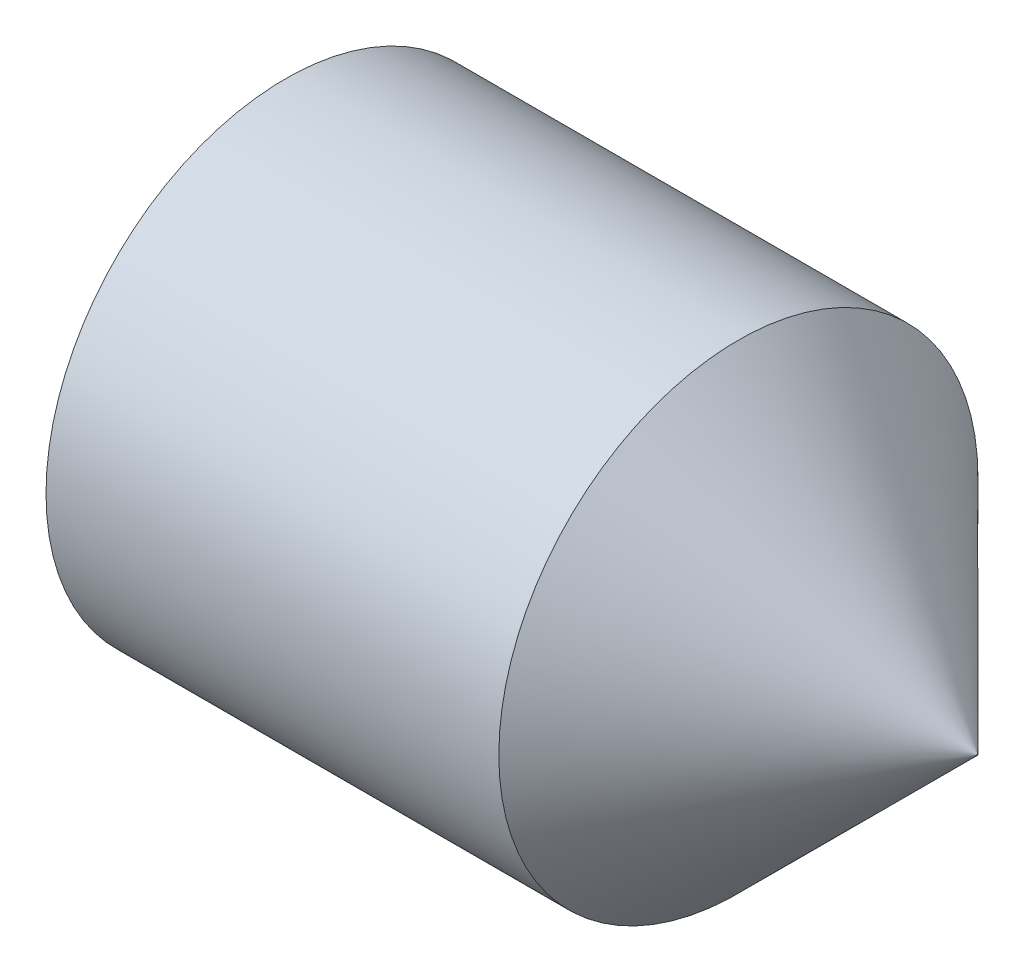
ISO-10303-21;
HEADER;
FILE_DESCRIPTION(('STEP AP214'),'2;1');
FILE_NAME('part.step','',(''),(''),'','','');
FILE_SCHEMA(('AUTOMOTIVE_DESIGN { 1 0 10303 214 1 1 1 1 }'));
ENDSEC;
DATA;
#1=APPLICATION_CONTEXT('core data for automotive mechanical design processes');
#2=APPLICATION_PROTOCOL_DEFINITION('international standard','automotive_design',2000,#1);
#3=PRODUCT_CONTEXT('',#1,'mechanical');
#4=PRODUCT('Part','Part','',(#3));
#5=PRODUCT_RELATED_PRODUCT_CATEGORY('part','',(#4));
#6=PRODUCT_DEFINITION_FORMATION('','',#4);
#7=PRODUCT_DEFINITION_CONTEXT('part definition',#1,'design');
#8=PRODUCT_DEFINITION('design','',#6,#7);
#9=PRODUCT_DEFINITION_SHAPE('','',#8);
#10=(LENGTH_UNIT() NAMED_UNIT(*) SI_UNIT(.MILLI.,.METRE.));
#11=(NAMED_UNIT(*) PLANE_ANGLE_UNIT() SI_UNIT($,.RADIAN.));
#12=(NAMED_UNIT(*) SI_UNIT($,.STERADIAN.) SOLID_ANGLE_UNIT());
#13=UNCERTAINTY_MEASURE_WITH_UNIT(LENGTH_MEASURE(1.E-05),#10,'distance_accuracy_value','');
#14=(GEOMETRIC_REPRESENTATION_CONTEXT(3) GLOBAL_UNCERTAINTY_ASSIGNED_CONTEXT((#13)) GLOBAL_UNIT_ASSIGNED_CONTEXT((#10,
#11,#12)) REPRESENTATION_CONTEXT('',''));
#15=CARTESIAN_POINT('',(0.,0.,0.));
#16=DIRECTION('',(0.,0.,1.));
#17=DIRECTION('',(1.,0.,0.));
#18=AXIS2_PLACEMENT_3D('',#15,#16,#17);
#19=CARTESIAN_POINT('',(0.,0.,0.));
#20=DIRECTION('',(-1.,0.,0.));
#21=DIRECTION('',(0.,0.,1.));
#22=AXIS2_PLACEMENT_3D('',#19,#20,#21);
#23=PLANE('',#22);
#24=CARTESIAN_POINT('',(0.,0.,0.));
#25=DIRECTION('',(-1.,0.,0.));
#26=DIRECTION('',(0.,0.,1.));
#27=AXIS2_PLACEMENT_3D('',#24,#25,#26);
#28=CIRCLE('',#27,1.61);
#29=CARTESIAN_POINT('',(0.,0.,1.61));
#30=VERTEX_POINT('',#29);
#31=EDGE_CURVE('E11',#30,#30,#28,.T.);
#32=ORIENTED_EDGE('',*,*,#31,.T.);
#33=EDGE_LOOP('',(#32));
#34=FACE_BOUND('',#33,.T.);
#35=DIRECTION('',(0.,0.,-1.));
#36=VECTOR('',#35,1.);
#37=CARTESIAN_POINT('',(0.,1.,0.577350269189622));
#38=LINE('',#37,#36);
#39=CARTESIAN_POINT('',(0.,1.,0.577350269189622));
#40=VERTEX_POINT('',#39);
#41=CARTESIAN_POINT('',(0.,1.,-0.577350269189629));
#42=VERTEX_POINT('',#41);
#43=EDGE_CURVE('E127',#40,#42,#38,.T.);
#44=ORIENTED_EDGE('',*,*,#43,.F.);
#45=DIRECTION('',(0.,-0.866025403784438,0.500000000000001));
#46=VECTOR('',#45,1.);
#47=CARTESIAN_POINT('',(0.,1.,0.577350269189622));
#48=LINE('',#47,#46);
#49=CARTESIAN_POINT('',(0.,0.,1.15470053837925));
#50=VERTEX_POINT('',#49);
#51=EDGE_CURVE('E49',#40,#50,#48,.T.);
#52=ORIENTED_EDGE('',*,*,#51,.T.);
#53=DIRECTION('',(0.,0.866025403784438,0.5));
#54=VECTOR('',#53,1.);
#55=CARTESIAN_POINT('',(0.,-0.999999999999996,0.577350269189623));
#56=LINE('',#55,#54);
#57=CARTESIAN_POINT('',(0.,-0.999999999999996,0.577350269189623));
#58=VERTEX_POINT('',#57);
#59=EDGE_CURVE('E118',#58,#50,#56,.T.);
#60=ORIENTED_EDGE('',*,*,#59,.F.);
#61=DIRECTION('',(0.,0.,-1.));
#62=VECTOR('',#61,1.);
#63=CARTESIAN_POINT('',(0.,-0.999999999999996,0.577350269189623));
#64=LINE('',#63,#62);
#65=CARTESIAN_POINT('',(0.,-0.999999999999996,-0.577350269189628));
#66=VERTEX_POINT('',#65);
#67=EDGE_CURVE('E121',#58,#66,#64,.T.);
#68=ORIENTED_EDGE('',*,*,#67,.T.);
#69=DIRECTION('',(0.,0.866025403784438,-0.500000000000001));
#70=VECTOR('',#69,1.);
#71=CARTESIAN_POINT('',(0.,-0.999999999999996,-0.577350269189628));
#72=LINE('',#71,#70);
#73=CARTESIAN_POINT('',(0.,0.,-1.15470053837925));
#74=VERTEX_POINT('',#73);
#75=EDGE_CURVE('E124',#66,#74,#72,.T.);
#76=ORIENTED_EDGE('',*,*,#75,.T.);
#77=DIRECTION('',(0.,-0.866025403784439,-0.5));
#78=VECTOR('',#77,1.);
#79=CARTESIAN_POINT('',(0.,1.,-0.577350269189629));
#80=LINE('',#79,#78);
#81=EDGE_CURVE('E107',#42,#74,#80,.T.);
#82=ORIENTED_EDGE('',*,*,#81,.F.);
#83=EDGE_LOOP('',(#44,#52,#60,#68,#76,#82));
#84=FACE_BOUND('',#83,.T.);
#85=ADVANCED_FACE('F35',(#34,#84),#23,.T.);
#86=CARTESIAN_POINT('',(0.,0.,0.));
#87=DIRECTION('',(1.,0.,0.));
#88=DIRECTION('',(0.,0.,-1.));
#89=AXIS2_PLACEMENT_3D('',#86,#87,#88);
#90=CONICAL_SURFACE('',#89,1.61,1.0471975511966);
#91=CARTESIAN_POINT('',(0.225166604983952,0.,0.));
#92=DIRECTION('',(-1.,0.,0.));
#93=DIRECTION('',(0.,0.,1.));
#94=AXIS2_PLACEMENT_3D('',#91,#92,#93);
#95=CIRCLE('',#94,2.);
#96=CARTESIAN_POINT('',(0.225166604983952,0.,2.));
#97=VERTEX_POINT('',#96);
#98=EDGE_CURVE('E42',#97,#97,#95,.T.);
#99=ORIENTED_EDGE('',*,*,#98,.T.);
#100=EDGE_LOOP('',(#99));
#101=FACE_BOUND('',#100,.T.);
#102=ORIENTED_EDGE('',*,*,#31,.F.);
#103=EDGE_LOOP('',(#102));
#104=FACE_BOUND('',#103,.T.);
#105=ADVANCED_FACE('F144',(#101,#104),#90,.T.);
#106=CARTESIAN_POINT('',(-12.7,0.,0.));
#107=DIRECTION('',(-1.,0.,0.));
#108=DIRECTION('',(0.,0.,1.));
#109=AXIS2_PLACEMENT_3D('',#106,#107,#108);
#110=CYLINDRICAL_SURFACE('',#109,2.);
#111=CARTESIAN_POINT('',(4.00500000000001,0.,0.));
#112=DIRECTION('',(-1.,0.,0.));
#113=DIRECTION('',(0.,0.,1.));
#114=AXIS2_PLACEMENT_3D('',#111,#112,#113);
#115=CIRCLE('',#114,2.);
#116=CARTESIAN_POINT('',(4.00500000000001,0.,2.));
#117=VERTEX_POINT('',#116);
#118=EDGE_CURVE('E139',#117,#117,#115,.T.);
#119=ORIENTED_EDGE('',*,*,#118,.T.);
#120=EDGE_LOOP('',(#119));
#121=FACE_BOUND('',#120,.T.);
#122=ORIENTED_EDGE('',*,*,#98,.F.);
#123=EDGE_LOOP('',(#122));
#124=FACE_BOUND('',#123,.T.);
#125=ADVANCED_FACE('F147',(#121,#124),#110,.T.);
#126=CARTESIAN_POINT('',(6.,0.,0.));
#127=DIRECTION('',(-1.,0.,0.));
#128=DIRECTION('',(0.,0.,1.));
#129=AXIS2_PLACEMENT_3D('',#126,#127,#128);
#130=CONICAL_SURFACE('',#129,0.005,0.78539816339745);
#131=CARTESIAN_POINT('',(6.,0.,0.));
#132=DIRECTION('',(-1.,0.,0.));
#133=DIRECTION('',(0.,0.,1.));
#134=AXIS2_PLACEMENT_3D('',#131,#132,#133);
#135=CIRCLE('',#134,0.005);
#136=CARTESIAN_POINT('',(6.,0.,0.00499999999999957));
#137=VERTEX_POINT('',#136);
#138=EDGE_CURVE('E136',#137,#137,#135,.T.);
#139=CARTESIAN_POINT('',(4.00500000000001,0.,2.));
#140=CARTESIAN_POINT('',(4.02578125000001,0.,1.97921875));
#141=CARTESIAN_POINT('',(4.04656250000001,0.,1.9584375));
#142=CARTESIAN_POINT('',(4.08812500000001,0.,1.916875));
#143=CARTESIAN_POINT('',(4.10890625000001,0.,1.89609375));
#144=CARTESIAN_POINT('',(4.15046875000001,0.,1.85453125));
#145=CARTESIAN_POINT('',(4.17125000000001,0.,1.83375));
#146=CARTESIAN_POINT('',(4.21281250000001,0.,1.7921875));
#147=CARTESIAN_POINT('',(4.23359375000001,0.,1.77140625));
#148=CARTESIAN_POINT('',(4.27515625,0.,1.72984375));
#149=CARTESIAN_POINT('',(4.2959375,0.,1.7090625));
#150=CARTESIAN_POINT('',(4.3375,0.,1.6675));
#151=CARTESIAN_POINT('',(4.35828125,0.,1.64671875));
#152=CARTESIAN_POINT('',(4.39984375,0.,1.60515625));
#153=CARTESIAN_POINT('',(4.420625,0.,1.584375));
#154=CARTESIAN_POINT('',(4.4621875,0.,1.5428125));
#155=CARTESIAN_POINT('',(4.48296875,0.,1.52203125));
#156=CARTESIAN_POINT('',(4.52453125,0.,1.48046875));
#157=CARTESIAN_POINT('',(4.5453125,0.,1.4596875));
#158=CARTESIAN_POINT('',(4.586875,0.,1.418125));
#159=CARTESIAN_POINT('',(4.60765625,0.,1.39734375));
#160=CARTESIAN_POINT('',(4.64921875,0.,1.35578125));
#161=CARTESIAN_POINT('',(4.67,0.,1.335));
#162=CARTESIAN_POINT('',(4.7115625,0.,1.2934375));
#163=CARTESIAN_POINT('',(4.73234375,0.,1.27265625));
#164=CARTESIAN_POINT('',(4.77390625,0.,1.23109375));
#165=CARTESIAN_POINT('',(4.7946875,0.,1.2103125));
#166=CARTESIAN_POINT('',(4.83625,0.,1.16875));
#167=CARTESIAN_POINT('',(4.85703125,0.,1.14796875));
#168=CARTESIAN_POINT('',(4.89859375,0.,1.10640625));
#169=CARTESIAN_POINT('',(4.919375,0.,1.085625));
#170=CARTESIAN_POINT('',(4.9609375,0.,1.0440625));
#171=CARTESIAN_POINT('',(4.98171875,0.,1.02328125));
#172=CARTESIAN_POINT('',(5.02328125,0.,0.98171875));
#173=CARTESIAN_POINT('',(5.0440625,0.,0.9609375));
#174=CARTESIAN_POINT('',(5.085625,0.,0.919375));
#175=CARTESIAN_POINT('',(5.10640625,0.,0.89859375));
#176=CARTESIAN_POINT('',(5.14796875,0.,0.857031249999999));
#177=CARTESIAN_POINT('',(5.16875,0.,0.83625));
#178=CARTESIAN_POINT('',(5.2103125,0.,0.7946875));
#179=CARTESIAN_POINT('',(5.23109375,0.,0.77390625));
#180=CARTESIAN_POINT('',(5.27265625,0.,0.73234375));
#181=CARTESIAN_POINT('',(5.2934375,0.,0.7115625));
#182=CARTESIAN_POINT('',(5.335,0.,0.669999999999999));
#183=CARTESIAN_POINT('',(5.35578125,0.,0.64921875));
#184=CARTESIAN_POINT('',(5.39734375,0.,0.607656249999999));
#185=CARTESIAN_POINT('',(5.418125,0.,0.586874999999999));
#186=CARTESIAN_POINT('',(5.4596875,0.,0.5453125));
#187=CARTESIAN_POINT('',(5.48046875,0.,0.52453125));
#188=CARTESIAN_POINT('',(5.52203125,0.,0.48296875));
#189=CARTESIAN_POINT('',(5.5428125,0.,0.4621875));
#190=CARTESIAN_POINT('',(5.584375,0.,0.420625));
#191=CARTESIAN_POINT('',(5.60515625,0.,0.39984375));
#192=CARTESIAN_POINT('',(5.64671875,0.,0.35828125));
#193=CARTESIAN_POINT('',(5.6675,0.,0.3375));
#194=CARTESIAN_POINT('',(5.7090625,0.,0.295937499999999));
#195=CARTESIAN_POINT('',(5.72984375,0.,0.27515625));
#196=CARTESIAN_POINT('',(5.77140625,0.,0.23359375));
#197=CARTESIAN_POINT('',(5.7921875,0.,0.2128125));
#198=CARTESIAN_POINT('',(5.83375,0.,0.17125));
#199=CARTESIAN_POINT('',(5.85453125,0.,0.15046875));
#200=CARTESIAN_POINT('',(5.89609375,0.,0.10890625));
#201=CARTESIAN_POINT('',(5.916875,0.,0.0881249999999996));
#202=CARTESIAN_POINT('',(5.9584375,0.,0.0465624999999996));
#203=CARTESIAN_POINT('',(5.97921875,0.,0.0257812499999996));
#204=CARTESIAN_POINT('',(6.,0.,0.00499999999999957));
#205=B_SPLINE_CURVE_WITH_KNOTS('',3,(#139,#140,#141,#142,#143,#144,#145,#146,#147,#148,#149,
#150,#151,#152,#153,#154,#155,#156,#157,#158,#159,#160,#161,#162,#163,#164,#165,#166,#167,#168,
#169,#170,#171,#172,#173,#174,#175,#176,#177,#178,#179,#180,#181,#182,#183,#184,#185,#186,#187,
#188,#189,#190,#191,#192,#193,#194,#195,#196,#197,#198,#199,#200,#201,#202,#203,#204),
.UNSPECIFIED.,.F.,.F.,(4,2,2,2,2,2,2,2,2,2,2,2,2,2,2,2,2,2,2,2,2,2,2,2,2,2,2,2,2,2,2,2,4),(0.,
0.0881673767791972,0.176334753558395,0.264502130337592,0.352669507116789,0.440836883895987,
0.529004260675184,0.617171637454382,0.70533901423358,0.793506391012777,0.881673767791975,
0.969841144571172,1.05800852135037,1.14617589812957,1.23434327490876,1.32251065168796,
1.41067802846716,1.49884540524636,1.58701278202555,1.67518015880475,1.76334753558395,
1.85151491236315,1.93968228914234,2.02784966592154,2.11601704270074,2.20418441947994,
2.29235179625913,2.38051917303833,2.46868654981753,2.55685392659673,2.64502130337592,
2.73318868015512,2.82135605693432),.UNSPECIFIED.);
#206=EDGE_CURVE('BSEAM149',#117,#137,#205,.T.);
#207=ORIENTED_EDGE('',*,*,#118,.F.);
#208=ORIENTED_EDGE('',*,*,#138,.T.);
#209=ORIENTED_EDGE('',*,*,#206,.T.);
#210=ORIENTED_EDGE('',*,*,#206,.F.);
#211=EDGE_LOOP('',(#207,#209,#208,#210));
#212=FACE_BOUND('',#211,.T.);
#213=ADVANCED_FACE('F149',(#212),#130,.T.);
#214=CARTESIAN_POINT('',(6.,0.,0.));
#215=DIRECTION('',(-1.,0.,0.));
#216=DIRECTION('',(0.,0.,1.));
#217=AXIS2_PLACEMENT_3D('',#214,#215,#216);
#218=PLANE('',#217);
#219=ORIENTED_EDGE('',*,*,#138,.F.);
#220=EDGE_LOOP('',(#219));
#221=FACE_BOUND('',#220,.T.);
#222=ADVANCED_FACE('F156',(#221),#218,.F.);
#223=CARTESIAN_POINT('',(2.3,1.,0.577350269189622));
#224=DIRECTION('',(0.,-0.500000000000001,-0.866025403784438));
#225=DIRECTION('',(0.,0.866025403784438,-0.500000000000001));
#226=AXIS2_PLACEMENT_3D('',#223,#224,#225);
#227=PLANE('',#226);
#228=ORIENTED_EDGE('',*,*,#51,.F.);
#229=DIRECTION('',(-1.,0.,0.));
#230=VECTOR('',#229,1.);
#231=CARTESIAN_POINT('',(2.3,1.,0.577350269189622));
#232=LINE('',#231,#230);
#233=CARTESIAN_POINT('',(2.3,1.,0.577350269189622));
#234=VERTEX_POINT('',#233);
#235=EDGE_CURVE('E54',#234,#40,#232,.T.);
#236=ORIENTED_EDGE('',*,*,#235,.F.);
#237=DIRECTION('',(0.,-0.866025403784438,0.500000000000001));
#238=VECTOR('',#237,1.);
#239=CARTESIAN_POINT('',(2.3,1.,0.577350269189622));
#240=LINE('',#239,#238);
#241=CARTESIAN_POINT('',(2.3,0.,1.15470053837925));
#242=VERTEX_POINT('',#241);
#243=EDGE_CURVE('E81',#234,#242,#240,.T.);
#244=ORIENTED_EDGE('',*,*,#243,.T.);
#245=DIRECTION('',(-1.,0.,0.));
#246=VECTOR('',#245,1.);
#247=CARTESIAN_POINT('',(2.3,0.,1.15470053837925));
#248=LINE('',#247,#246);
#249=EDGE_CURVE('E134',#242,#50,#248,.T.);
#250=ORIENTED_EDGE('',*,*,#249,.T.);
#251=EDGE_LOOP('',(#228,#236,#244,#250));
#252=FACE_BOUND('',#251,.T.);
#253=ADVANCED_FACE('F187',(#252),#227,.T.);
#254=CARTESIAN_POINT('',(2.3,-0.999999999999996,0.577350269189623));
#255=DIRECTION('',(0.,-0.5,0.866025403784439));
#256=DIRECTION('',(0.,-0.866025403784439,-0.5));
#257=AXIS2_PLACEMENT_3D('',#254,#255,#256);
#258=PLANE('',#257);
#259=ORIENTED_EDGE('',*,*,#59,.T.);
#260=ORIENTED_EDGE('',*,*,#249,.F.);
#261=DIRECTION('',(0.,0.866025403784438,0.5));
#262=VECTOR('',#261,1.);
#263=CARTESIAN_POINT('',(2.3,-0.999999999999996,0.577350269189623));
#264=LINE('',#263,#262);
#265=CARTESIAN_POINT('',(2.3,-0.999999999999996,0.577350269189623));
#266=VERTEX_POINT('',#265);
#267=EDGE_CURVE('E266',#266,#242,#264,.T.);
#268=ORIENTED_EDGE('',*,*,#267,.F.);
#269=DIRECTION('',(-1.,0.,0.));
#270=VECTOR('',#269,1.);
#271=CARTESIAN_POINT('',(2.3,-0.999999999999996,0.577350269189623));
#272=LINE('',#271,#270);
#273=EDGE_CURVE('E132',#266,#58,#272,.T.);
#274=ORIENTED_EDGE('',*,*,#273,.T.);
#275=EDGE_LOOP('',(#259,#260,#268,#274));
#276=FACE_BOUND('',#275,.T.);
#277=ADVANCED_FACE('F183',(#276),#258,.F.);
#278=CARTESIAN_POINT('',(2.3,-0.999999999999996,0.577350269189623));
#279=DIRECTION('',(0.,1.,0.));
#280=DIRECTION('',(0.,0.,1.));
#281=AXIS2_PLACEMENT_3D('',#278,#279,#280);
#282=PLANE('',#281);
#283=ORIENTED_EDGE('',*,*,#67,.F.);
#284=ORIENTED_EDGE('',*,*,#273,.F.);
#285=DIRECTION('',(0.,0.,-1.));
#286=VECTOR('',#285,1.);
#287=CARTESIAN_POINT('',(2.3,-0.999999999999996,0.577350269189623));
#288=LINE('',#287,#286);
#289=CARTESIAN_POINT('',(2.3,-0.999999999999996,-0.577350269189628));
#290=VERTEX_POINT('',#289);
#291=EDGE_CURVE('E102',#266,#290,#288,.T.);
#292=ORIENTED_EDGE('',*,*,#291,.T.);
#293=DIRECTION('',(-1.,0.,0.));
#294=VECTOR('',#293,1.);
#295=CARTESIAN_POINT('',(2.3,-0.999999999999996,-0.577350269189628));
#296=LINE('',#295,#294);
#297=EDGE_CURVE('E97',#290,#66,#296,.T.);
#298=ORIENTED_EDGE('',*,*,#297,.T.);
#299=EDGE_LOOP('',(#283,#284,#292,#298));
#300=FACE_BOUND('',#299,.T.);
#301=ADVANCED_FACE('F180',(#300),#282,.T.);
#302=CARTESIAN_POINT('',(2.3,-0.999999999999996,-0.577350269189628));
#303=DIRECTION('',(0.,0.500000000000001,0.866025403784438));
#304=DIRECTION('',(0.,-0.866025403784438,0.500000000000001));
#305=AXIS2_PLACEMENT_3D('',#302,#303,#304);
#306=PLANE('',#305);
#307=ORIENTED_EDGE('',*,*,#75,.F.);
#308=ORIENTED_EDGE('',*,*,#297,.F.);
#309=DIRECTION('',(0.,0.866025403784438,-0.500000000000001));
#310=VECTOR('',#309,1.);
#311=CARTESIAN_POINT('',(2.3,-0.999999999999996,-0.577350269189628));
#312=LINE('',#311,#310);
#313=CARTESIAN_POINT('',(2.3,0.,-1.15470053837925));
#314=VERTEX_POINT('',#313);
#315=EDGE_CURVE('E92',#290,#314,#312,.T.);
#316=ORIENTED_EDGE('',*,*,#315,.T.);
#317=DIRECTION('',(-1.,0.,0.));
#318=VECTOR('',#317,1.);
#319=CARTESIAN_POINT('',(2.3,0.,-1.15470053837925));
#320=LINE('',#319,#318);
#321=EDGE_CURVE('E96',#314,#74,#320,.T.);
#322=ORIENTED_EDGE('',*,*,#321,.T.);
#323=EDGE_LOOP('',(#307,#308,#316,#322));
#324=FACE_BOUND('',#323,.T.);
#325=ADVANCED_FACE('F95',(#324),#306,.T.);
#326=CARTESIAN_POINT('',(2.3,1.,-0.577350269189629));
#327=DIRECTION('',(0.,0.5,-0.866025403784439));
#328=DIRECTION('',(0.,0.866025403784439,0.5));
#329=AXIS2_PLACEMENT_3D('',#326,#327,#328);
#330=PLANE('',#329);
#331=ORIENTED_EDGE('',*,*,#81,.T.);
#332=ORIENTED_EDGE('',*,*,#321,.F.);
#333=DIRECTION('',(0.,-0.866025403784439,-0.5));
#334=VECTOR('',#333,1.);
#335=CARTESIAN_POINT('',(2.3,1.,-0.577350269189629));
#336=LINE('',#335,#334);
#337=CARTESIAN_POINT('',(2.3,1.,-0.577350269189629));
#338=VERTEX_POINT('',#337);
#339=EDGE_CURVE('E101',#338,#314,#336,.T.);
#340=ORIENTED_EDGE('',*,*,#339,.F.);
#341=DIRECTION('',(-1.,0.,0.));
#342=VECTOR('',#341,1.);
#343=CARTESIAN_POINT('',(2.3,1.,-0.577350269189629));
#344=LINE('',#343,#342);
#345=EDGE_CURVE('E77',#338,#42,#344,.T.);
#346=ORIENTED_EDGE('',*,*,#345,.T.);
#347=EDGE_LOOP('',(#331,#332,#340,#346));
#348=FACE_BOUND('',#347,.T.);
#349=ADVANCED_FACE('F104',(#348),#330,.F.);
#350=CARTESIAN_POINT('',(2.3,1.,0.577350269189622));
#351=DIRECTION('',(0.,1.,0.));
#352=DIRECTION('',(0.,0.,1.));
#353=AXIS2_PLACEMENT_3D('',#350,#351,#352);
#354=PLANE('',#353);
#355=ORIENTED_EDGE('',*,*,#43,.T.);
#356=ORIENTED_EDGE('',*,*,#345,.F.);
#357=DIRECTION('',(0.,0.,-1.));
#358=VECTOR('',#357,1.);
#359=CARTESIAN_POINT('',(2.3,1.,0.577350269189622));
#360=LINE('',#359,#358);
#361=EDGE_CURVE('E112',#234,#338,#360,.T.);
#362=ORIENTED_EDGE('',*,*,#361,.F.);
#363=ORIENTED_EDGE('',*,*,#235,.T.);
#364=EDGE_LOOP('',(#355,#356,#362,#363));
#365=FACE_BOUND('',#364,.T.);
#366=ADVANCED_FACE('F168',(#365),#354,.F.);
#367=CARTESIAN_POINT('',(2.3,0.,1.15470053837925));
#368=DIRECTION('',(-1.,0.,0.));
#369=DIRECTION('',(0.,0.,1.));
#370=AXIS2_PLACEMENT_3D('',#367,#368,#369);
#371=PLANE('',#370);
#372=ORIENTED_EDGE('',*,*,#243,.F.);
#373=ORIENTED_EDGE('',*,*,#361,.T.);
#374=ORIENTED_EDGE('',*,*,#339,.T.);
#375=ORIENTED_EDGE('',*,*,#315,.F.);
#376=ORIENTED_EDGE('',*,*,#291,.F.);
#377=ORIENTED_EDGE('',*,*,#267,.T.);
#378=EDGE_LOOP('',(#372,#373,#374,#375,#376,#377));
#379=FACE_BOUND('',#378,.T.);
#380=ADVANCED_FACE('F110',(#379),#371,.T.);
#381=CLOSED_SHELL('',(#85,#105,#125,#213,#222,#253,#277,#301,#325,#349,#366,#380));
#382=MANIFOLD_SOLID_BREP('B2',#381);
#383=ADVANCED_BREP_SHAPE_REPRESENTATION('',(#18,#382),#14);
#384=SHAPE_DEFINITION_REPRESENTATION(#9,#383);
ENDSEC;
END-ISO-10303-21;
